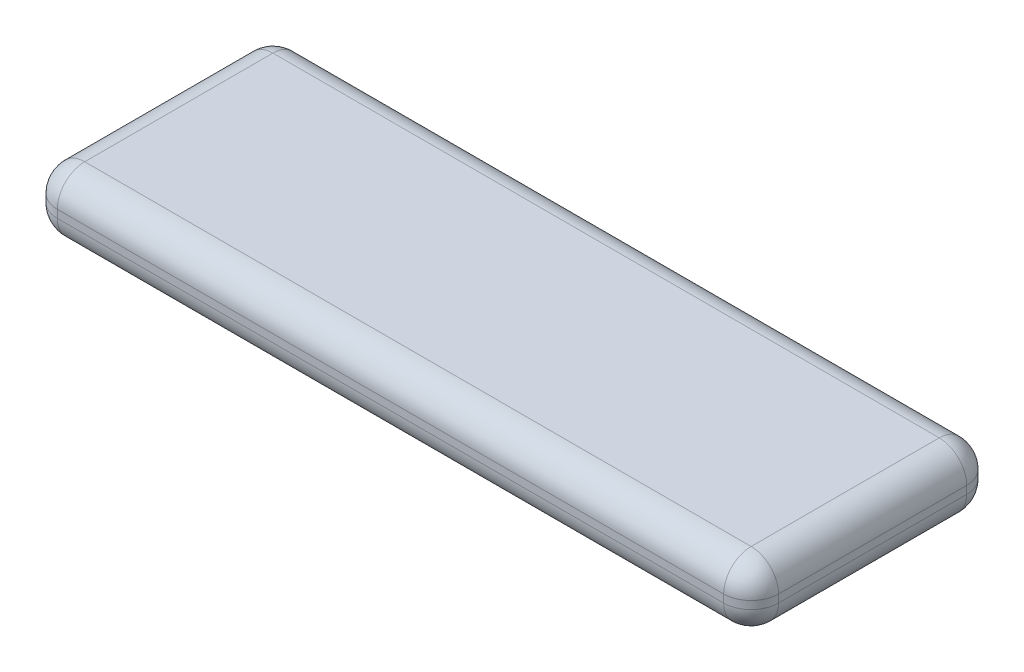
ISO-10303-21;
HEADER;
FILE_DESCRIPTION(('STEP AP214'),'2;1');
FILE_NAME('part.step','',(''),(''),'','','');
FILE_SCHEMA(('AUTOMOTIVE_DESIGN { 1 0 10303 214 1 1 1 1 }'));
ENDSEC;
DATA;
#1=APPLICATION_CONTEXT('core data for automotive mechanical design processes');
#2=APPLICATION_PROTOCOL_DEFINITION('international standard','automotive_design',2000,#1);
#3=PRODUCT_CONTEXT('',#1,'mechanical');
#4=PRODUCT('Part','Part','',(#3));
#5=PRODUCT_RELATED_PRODUCT_CATEGORY('part','',(#4));
#6=PRODUCT_DEFINITION_FORMATION('','',#4);
#7=PRODUCT_DEFINITION_CONTEXT('part definition',#1,'design');
#8=PRODUCT_DEFINITION('design','',#6,#7);
#9=PRODUCT_DEFINITION_SHAPE('','',#8);
#10=(LENGTH_UNIT() NAMED_UNIT(*) SI_UNIT(.MILLI.,.METRE.));
#11=(NAMED_UNIT(*) PLANE_ANGLE_UNIT() SI_UNIT($,.RADIAN.));
#12=(NAMED_UNIT(*) SI_UNIT($,.STERADIAN.) SOLID_ANGLE_UNIT());
#13=UNCERTAINTY_MEASURE_WITH_UNIT(LENGTH_MEASURE(1.E-05),#10,'distance_accuracy_value','');
#14=(GEOMETRIC_REPRESENTATION_CONTEXT(3) GLOBAL_UNCERTAINTY_ASSIGNED_CONTEXT((#13)) GLOBAL_UNIT_ASSIGNED_CONTEXT((#10,
#11,#12)) REPRESENTATION_CONTEXT('',''));
#15=CARTESIAN_POINT('',(0.,0.,0.));
#16=DIRECTION('',(0.,0.,1.));
#17=DIRECTION('',(1.,0.,0.));
#18=AXIS2_PLACEMENT_3D('',#15,#16,#17);
#19=CARTESIAN_POINT('',(42.5,-37.5,119.));
#20=DIRECTION('',(0.,-1.,0.));
#21=DIRECTION('',(1.,0.,0.));
#22=AXIS2_PLACEMENT_3D('',#19,#20,#21);
#23=SPHERICAL_SURFACE('',#22,3.5);
#24=CARTESIAN_POINT('',(42.5,-37.5,119.));
#25=DIRECTION('',(0.,0.,-1.));
#26=DIRECTION('',(1.,0.,0.));
#27=AXIS2_PLACEMENT_3D('',#24,#25,#26);
#28=CIRCLE('',#27,3.5);
#29=CARTESIAN_POINT('',(42.5,-34.,119.));
#30=VERTEX_POINT('',#29);
#31=CARTESIAN_POINT('',(46.,-37.5,119.));
#32=VERTEX_POINT('',#31);
#33=EDGE_CURVE('E10',#30,#32,#28,.T.);
#34=ORIENTED_EDGE('',*,*,#33,.F.);
#35=CARTESIAN_POINT('',(42.5,-37.5,119.));
#36=DIRECTION('',(1.,0.,0.));
#37=DIRECTION('',(0.,0.,1.));
#38=AXIS2_PLACEMENT_3D('',#35,#36,#37);
#39=CIRCLE('',#38,3.5);
#40=CARTESIAN_POINT('',(42.5,-37.5,122.5));
#41=VERTEX_POINT('',#40);
#42=EDGE_CURVE('E313',#30,#41,#39,.T.);
#43=ORIENTED_EDGE('',*,*,#42,.T.);
#44=CARTESIAN_POINT('',(42.5,-37.5,119.));
#45=DIRECTION('',(0.,-1.,0.));
#46=DIRECTION('',(1.,0.,0.));
#47=AXIS2_PLACEMENT_3D('',#44,#45,#46);
#48=CIRCLE('',#47,3.5);
#49=EDGE_CURVE('E205',#32,#41,#48,.T.);
#50=ORIENTED_EDGE('',*,*,#49,.F.);
#51=EDGE_LOOP('',(#34,#43,#50));
#52=FACE_BOUND('',#51,.T.);
#53=ADVANCED_FACE('F16',(#52),#23,.T.);
#54=CARTESIAN_POINT('',(42.5,-37.5,95.));
#55=DIRECTION('',(0.,0.,1.));
#56=DIRECTION('',(1.,0.,0.));
#57=AXIS2_PLACEMENT_3D('',#54,#55,#56);
#58=SPHERICAL_SURFACE('',#57,3.5);
#59=CARTESIAN_POINT('',(42.5,-37.5,95.));
#60=DIRECTION('',(0.,-1.,0.));
#61=DIRECTION('',(1.,0.,0.));
#62=AXIS2_PLACEMENT_3D('',#59,#60,#61);
#63=CIRCLE('',#62,3.5);
#64=CARTESIAN_POINT('',(42.5,-37.5,91.5));
#65=VERTEX_POINT('',#64);
#66=CARTESIAN_POINT('',(46.,-37.5,95.));
#67=VERTEX_POINT('',#66);
#68=EDGE_CURVE('E299',#65,#67,#63,.T.);
#69=ORIENTED_EDGE('',*,*,#68,.F.);
#70=CARTESIAN_POINT('',(42.5,-37.5,95.));
#71=DIRECTION('',(1.,0.,0.));
#72=DIRECTION('',(0.,1.,0.));
#73=AXIS2_PLACEMENT_3D('',#70,#71,#72);
#74=CIRCLE('',#73,3.5);
#75=CARTESIAN_POINT('',(42.5,-34.,95.));
#76=VERTEX_POINT('',#75);
#77=EDGE_CURVE('E219',#65,#76,#74,.T.);
#78=ORIENTED_EDGE('',*,*,#77,.T.);
#79=CARTESIAN_POINT('',(42.5,-37.5,95.));
#80=DIRECTION('',(0.,0.,1.));
#81=DIRECTION('',(1.,0.,0.));
#82=AXIS2_PLACEMENT_3D('',#79,#80,#81);
#83=CIRCLE('',#82,3.5);
#84=EDGE_CURVE('E19',#67,#76,#83,.T.);
#85=ORIENTED_EDGE('',*,*,#84,.F.);
#86=EDGE_LOOP('',(#69,#78,#85));
#87=FACE_BOUND('',#86,.T.);
#88=ADVANCED_FACE('F334',(#87),#58,.T.);
#89=CARTESIAN_POINT('',(46.,-42.,91.5));
#90=DIRECTION('',(1.,0.,0.));
#91=DIRECTION('',(0.,1.,0.));
#92=AXIS2_PLACEMENT_3D('',#89,#90,#91);
#93=PLANE('',#92);
#94=DIRECTION('',(0.,0.,1.));
#95=VECTOR('',#94,1.);
#96=CARTESIAN_POINT('',(46.,-38.5,91.5));
#97=LINE('',#96,#95);
#98=CARTESIAN_POINT('',(46.,-38.5,95.));
#99=VERTEX_POINT('',#98);
#100=CARTESIAN_POINT('',(46.,-38.5,119.));
#101=VERTEX_POINT('',#100);
#102=EDGE_CURVE('E223',#99,#101,#97,.T.);
#103=ORIENTED_EDGE('',*,*,#102,.F.);
#104=DIRECTION('',(0.,1.,0.));
#105=VECTOR('',#104,1.);
#106=CARTESIAN_POINT('',(46.,-42.,95.));
#107=LINE('',#106,#105);
#108=EDGE_CURVE('E303',#99,#67,#107,.T.);
#109=ORIENTED_EDGE('',*,*,#108,.T.);
#110=DIRECTION('',(0.,0.,1.));
#111=VECTOR('',#110,1.);
#112=CARTESIAN_POINT('',(46.,-37.5,91.5));
#113=LINE('',#112,#111);
#114=EDGE_CURVE('E321',#67,#32,#113,.T.);
#115=ORIENTED_EDGE('',*,*,#114,.T.);
#116=DIRECTION('',(0.,1.,0.));
#117=VECTOR('',#116,1.);
#118=CARTESIAN_POINT('',(46.,-42.,119.));
#119=LINE('',#118,#117);
#120=EDGE_CURVE('E209',#101,#32,#119,.T.);
#121=ORIENTED_EDGE('',*,*,#120,.F.);
#122=EDGE_LOOP('',(#103,#109,#115,#121));
#123=FACE_BOUND('',#122,.T.);
#124=ADVANCED_FACE('F360',(#123),#93,.T.);
#125=CARTESIAN_POINT('',(42.5,-38.5,119.));
#126=DIRECTION('',(0.,0.,-1.));
#127=DIRECTION('',(1.,0.,0.));
#128=AXIS2_PLACEMENT_3D('',#125,#126,#127);
#129=SPHERICAL_SURFACE('',#128,3.5);
#130=CARTESIAN_POINT('',(42.5,-38.5,119.));
#131=DIRECTION('',(0.,1.,0.));
#132=DIRECTION('',(1.,0.,0.));
#133=AXIS2_PLACEMENT_3D('',#130,#131,#132);
#134=CIRCLE('',#133,3.5);
#135=CARTESIAN_POINT('',(42.5,-38.5,122.5));
#136=VERTEX_POINT('',#135);
#137=EDGE_CURVE('E208',#136,#101,#134,.T.);
#138=ORIENTED_EDGE('',*,*,#137,.F.);
#139=CARTESIAN_POINT('',(42.5,-38.5,119.));
#140=DIRECTION('',(1.,0.,0.));
#141=DIRECTION('',(0.,-1.,0.));
#142=AXIS2_PLACEMENT_3D('',#139,#140,#141);
#143=CIRCLE('',#142,3.5);
#144=CARTESIAN_POINT('',(42.5,-42.,119.));
#145=VERTEX_POINT('',#144);
#146=EDGE_CURVE('E289',#136,#145,#143,.T.);
#147=ORIENTED_EDGE('',*,*,#146,.T.);
#148=CARTESIAN_POINT('',(42.5,-38.5,119.));
#149=DIRECTION('',(0.,0.,-1.));
#150=DIRECTION('',(1.,0.,0.));
#151=AXIS2_PLACEMENT_3D('',#148,#149,#150);
#152=CIRCLE('',#151,3.5);
#153=EDGE_CURVE('E293',#101,#145,#152,.T.);
#154=ORIENTED_EDGE('',*,*,#153,.F.);
#155=EDGE_LOOP('',(#138,#147,#154));
#156=FACE_BOUND('',#155,.T.);
#157=ADVANCED_FACE('F365',(#156),#129,.T.);
#158=CARTESIAN_POINT('',(42.5,-38.5,95.));
#159=DIRECTION('',(0.,0.,1.));
#160=DIRECTION('',(1.,0.,0.));
#161=AXIS2_PLACEMENT_3D('',#158,#159,#160);
#162=SPHERICAL_SURFACE('',#161,3.5);
#163=CARTESIAN_POINT('',(42.5,-38.5,95.));
#164=DIRECTION('',(0.,0.,-1.));
#165=DIRECTION('',(1.,0.,0.));
#166=AXIS2_PLACEMENT_3D('',#163,#164,#165);
#167=CIRCLE('',#166,3.5);
#168=CARTESIAN_POINT('',(42.5,-42.,95.));
#169=VERTEX_POINT('',#168);
#170=EDGE_CURVE('E296',#99,#169,#167,.T.);
#171=ORIENTED_EDGE('',*,*,#170,.T.);
#172=CARTESIAN_POINT('',(42.5,-38.5,95.));
#173=DIRECTION('',(-1.,0.,0.));
#174=DIRECTION('',(0.,-1.,0.));
#175=AXIS2_PLACEMENT_3D('',#172,#173,#174);
#176=CIRCLE('',#175,3.5);
#177=CARTESIAN_POINT('',(42.5,-38.5,91.5));
#178=VERTEX_POINT('',#177);
#179=EDGE_CURVE('E285',#178,#169,#176,.T.);
#180=ORIENTED_EDGE('',*,*,#179,.F.);
#181=CARTESIAN_POINT('',(42.5,-38.5,95.));
#182=DIRECTION('',(0.,-1.,0.));
#183=DIRECTION('',(1.,0.,0.));
#184=AXIS2_PLACEMENT_3D('',#181,#182,#183);
#185=CIRCLE('',#184,3.5);
#186=EDGE_CURVE('E222',#178,#99,#185,.T.);
#187=ORIENTED_EDGE('',*,*,#186,.T.);
#188=EDGE_LOOP('',(#171,#180,#187));
#189=FACE_BOUND('',#188,.T.);
#190=ADVANCED_FACE('F374',(#189),#162,.T.);
#191=CARTESIAN_POINT('',(42.5,-37.5,91.5));
#192=DIRECTION('',(0.,0.,1.));
#193=DIRECTION('',(1.,0.,0.));
#194=AXIS2_PLACEMENT_3D('',#191,#192,#193);
#195=CYLINDRICAL_SURFACE('',#194,3.5);
#196=ORIENTED_EDGE('',*,*,#114,.F.);
#197=ORIENTED_EDGE('',*,*,#84,.T.);
#198=DIRECTION('',(0.,0.,1.));
#199=VECTOR('',#198,1.);
#200=CARTESIAN_POINT('',(42.5,-34.,91.5));
#201=LINE('',#200,#199);
#202=EDGE_CURVE('E278',#76,#30,#201,.T.);
#203=ORIENTED_EDGE('',*,*,#202,.T.);
#204=ORIENTED_EDGE('',*,*,#33,.T.);
#205=EDGE_LOOP('',(#196,#197,#203,#204));
#206=FACE_BOUND('',#205,.T.);
#207=ADVANCED_FACE('F331',(#206),#195,.T.);
#208=CARTESIAN_POINT('',(42.5,-42.,119.));
#209=DIRECTION('',(0.,1.,0.));
#210=DIRECTION('',(1.,0.,0.));
#211=AXIS2_PLACEMENT_3D('',#208,#209,#210);
#212=CYLINDRICAL_SURFACE('',#211,3.5);
#213=ORIENTED_EDGE('',*,*,#120,.T.);
#214=ORIENTED_EDGE('',*,*,#49,.T.);
#215=DIRECTION('',(0.,1.,0.));
#216=VECTOR('',#215,1.);
#217=CARTESIAN_POINT('',(42.5,-42.,122.5));
#218=LINE('',#217,#216);
#219=EDGE_CURVE('E263',#136,#41,#218,.T.);
#220=ORIENTED_EDGE('',*,*,#219,.F.);
#221=ORIENTED_EDGE('',*,*,#137,.T.);
#222=EDGE_LOOP('',(#213,#214,#220,#221));
#223=FACE_BOUND('',#222,.T.);
#224=ADVANCED_FACE('F353',(#223),#212,.T.);
#225=CARTESIAN_POINT('',(-46.,-37.5,119.));
#226=DIRECTION('',(1.,0.,0.));
#227=DIRECTION('',(0.,1.,0.));
#228=AXIS2_PLACEMENT_3D('',#225,#226,#227);
#229=CYLINDRICAL_SURFACE('',#228,3.5);
#230=CARTESIAN_POINT('',(-42.5,-37.5,119.));
#231=DIRECTION('',(1.,0.,0.));
#232=DIRECTION('',(0.,0.,1.));
#233=AXIS2_PLACEMENT_3D('',#230,#231,#232);
#234=CIRCLE('',#233,3.5);
#235=CARTESIAN_POINT('',(-42.5,-34.,119.));
#236=VERTEX_POINT('',#235);
#237=CARTESIAN_POINT('',(-42.5,-37.5,122.5));
#238=VERTEX_POINT('',#237);
#239=EDGE_CURVE('E271',#236,#238,#234,.T.);
#240=ORIENTED_EDGE('',*,*,#239,.T.);
#241=DIRECTION('',(1.,0.,0.));
#242=VECTOR('',#241,1.);
#243=CARTESIAN_POINT('',(-46.,-37.5,122.5));
#244=LINE('',#243,#242);
#245=EDGE_CURVE('E267',#238,#41,#244,.T.);
#246=ORIENTED_EDGE('',*,*,#245,.T.);
#247=ORIENTED_EDGE('',*,*,#42,.F.);
#248=DIRECTION('',(1.,0.,0.));
#249=VECTOR('',#248,1.);
#250=CARTESIAN_POINT('',(-46.,-34.,119.));
#251=LINE('',#250,#249);
#252=EDGE_CURVE('E274',#236,#30,#251,.T.);
#253=ORIENTED_EDGE('',*,*,#252,.F.);
#254=EDGE_LOOP('',(#240,#246,#247,#253));
#255=FACE_BOUND('',#254,.T.);
#256=ADVANCED_FACE('F345',(#255),#229,.T.);
#257=CARTESIAN_POINT('',(42.5,-42.,95.));
#258=DIRECTION('',(0.,1.,0.));
#259=DIRECTION('',(1.,0.,0.));
#260=AXIS2_PLACEMENT_3D('',#257,#258,#259);
#261=CYLINDRICAL_SURFACE('',#260,3.5);
#262=ORIENTED_EDGE('',*,*,#186,.F.);
#263=DIRECTION('',(0.,1.,0.));
#264=VECTOR('',#263,1.);
#265=CARTESIAN_POINT('',(42.5,-42.,91.5));
#266=LINE('',#265,#264);
#267=EDGE_CURVE('E247',#178,#65,#266,.T.);
#268=ORIENTED_EDGE('',*,*,#267,.T.);
#269=ORIENTED_EDGE('',*,*,#68,.T.);
#270=ORIENTED_EDGE('',*,*,#108,.F.);
#271=EDGE_LOOP('',(#262,#268,#269,#270));
#272=FACE_BOUND('',#271,.T.);
#273=ADVANCED_FACE('F393',(#272),#261,.T.);
#274=CARTESIAN_POINT('',(-46.,-37.5,95.));
#275=DIRECTION('',(1.,0.,0.));
#276=DIRECTION('',(0.,1.,0.));
#277=AXIS2_PLACEMENT_3D('',#274,#275,#276);
#278=CYLINDRICAL_SURFACE('',#277,3.5);
#279=DIRECTION('',(1.,0.,0.));
#280=VECTOR('',#279,1.);
#281=CARTESIAN_POINT('',(-46.,-34.,95.));
#282=LINE('',#281,#280);
#283=CARTESIAN_POINT('',(-42.5,-34.,95.));
#284=VERTEX_POINT('',#283);
#285=EDGE_CURVE('E281',#284,#76,#282,.T.);
#286=ORIENTED_EDGE('',*,*,#285,.T.);
#287=ORIENTED_EDGE('',*,*,#77,.F.);
#288=DIRECTION('',(1.,0.,0.));
#289=VECTOR('',#288,1.);
#290=CARTESIAN_POINT('',(-46.,-37.5,91.5));
#291=LINE('',#290,#289);
#292=CARTESIAN_POINT('',(-42.5,-37.5,91.5));
#293=VERTEX_POINT('',#292);
#294=EDGE_CURVE('E240',#293,#65,#291,.T.);
#295=ORIENTED_EDGE('',*,*,#294,.F.);
#296=CARTESIAN_POINT('',(-42.5,-37.5,95.));
#297=DIRECTION('',(1.,0.,0.));
#298=DIRECTION('',(0.,1.,0.));
#299=AXIS2_PLACEMENT_3D('',#296,#297,#298);
#300=CIRCLE('',#299,3.5);
#301=EDGE_CURVE('E255',#293,#284,#300,.T.);
#302=ORIENTED_EDGE('',*,*,#301,.T.);
#303=EDGE_LOOP('',(#286,#287,#295,#302));
#304=FACE_BOUND('',#303,.T.);
#305=ADVANCED_FACE('F337',(#304),#278,.T.);
#306=CARTESIAN_POINT('',(42.5,-38.5,91.5));
#307=DIRECTION('',(0.,0.,1.));
#308=DIRECTION('',(1.,0.,0.));
#309=AXIS2_PLACEMENT_3D('',#306,#307,#308);
#310=CYLINDRICAL_SURFACE('',#309,3.5);
#311=ORIENTED_EDGE('',*,*,#153,.T.);
#312=DIRECTION('',(0.,0.,1.));
#313=VECTOR('',#312,1.);
#314=CARTESIAN_POINT('',(42.5,-42.,91.5));
#315=LINE('',#314,#313);
#316=EDGE_CURVE('E197',#169,#145,#315,.T.);
#317=ORIENTED_EDGE('',*,*,#316,.F.);
#318=ORIENTED_EDGE('',*,*,#170,.F.);
#319=ORIENTED_EDGE('',*,*,#102,.T.);
#320=EDGE_LOOP('',(#311,#317,#318,#319));
#321=FACE_BOUND('',#320,.T.);
#322=ADVANCED_FACE('F390',(#321),#310,.T.);
#323=CARTESIAN_POINT('',(-46.,-38.5,119.));
#324=DIRECTION('',(1.,0.,0.));
#325=DIRECTION('',(0.,-1.,0.));
#326=AXIS2_PLACEMENT_3D('',#323,#324,#325);
#327=CYLINDRICAL_SURFACE('',#326,3.5);
#328=DIRECTION('',(1.,0.,0.));
#329=VECTOR('',#328,1.);
#330=CARTESIAN_POINT('',(-46.,-42.,119.));
#331=LINE('',#330,#329);
#332=CARTESIAN_POINT('',(-42.5,-42.,119.));
#333=VERTEX_POINT('',#332);
#334=EDGE_CURVE('E201',#333,#145,#331,.T.);
#335=ORIENTED_EDGE('',*,*,#334,.T.);
#336=ORIENTED_EDGE('',*,*,#146,.F.);
#337=DIRECTION('',(1.,0.,0.));
#338=VECTOR('',#337,1.);
#339=CARTESIAN_POINT('',(-46.,-38.5,122.5));
#340=LINE('',#339,#338);
#341=CARTESIAN_POINT('',(-42.5,-38.5,122.5));
#342=VERTEX_POINT('',#341);
#343=EDGE_CURVE('E259',#342,#136,#340,.T.);
#344=ORIENTED_EDGE('',*,*,#343,.F.);
#345=CARTESIAN_POINT('',(-42.5,-38.5,119.));
#346=DIRECTION('',(1.,0.,0.));
#347=DIRECTION('',(0.,-1.,0.));
#348=AXIS2_PLACEMENT_3D('',#345,#346,#347);
#349=CIRCLE('',#348,3.5);
#350=EDGE_CURVE('E140',#342,#333,#349,.T.);
#351=ORIENTED_EDGE('',*,*,#350,.T.);
#352=EDGE_LOOP('',(#335,#336,#344,#351));
#353=FACE_BOUND('',#352,.T.);
#354=ADVANCED_FACE('F384',(#353),#327,.T.);
#355=CARTESIAN_POINT('',(-46.,-38.5,95.));
#356=DIRECTION('',(1.,0.,0.));
#357=DIRECTION('',(0.,-1.,0.));
#358=AXIS2_PLACEMENT_3D('',#355,#356,#357);
#359=CYLINDRICAL_SURFACE('',#358,3.5);
#360=CARTESIAN_POINT('',(-42.5,-38.5,95.));
#361=DIRECTION('',(-1.,0.,0.));
#362=DIRECTION('',(0.,-1.,0.));
#363=AXIS2_PLACEMENT_3D('',#360,#361,#362);
#364=CIRCLE('',#363,3.5);
#365=CARTESIAN_POINT('',(-42.5,-38.5,91.5));
#366=VERTEX_POINT('',#365);
#367=CARTESIAN_POINT('',(-42.5,-42.,95.));
#368=VERTEX_POINT('',#367);
#369=EDGE_CURVE('E185',#366,#368,#364,.T.);
#370=ORIENTED_EDGE('',*,*,#369,.F.);
#371=DIRECTION('',(1.,0.,0.));
#372=VECTOR('',#371,1.);
#373=CARTESIAN_POINT('',(-46.,-38.5,91.5));
#374=LINE('',#373,#372);
#375=EDGE_CURVE('E251',#366,#178,#374,.T.);
#376=ORIENTED_EDGE('',*,*,#375,.T.);
#377=ORIENTED_EDGE('',*,*,#179,.T.);
#378=DIRECTION('',(1.,0.,0.));
#379=VECTOR('',#378,1.);
#380=CARTESIAN_POINT('',(-46.,-42.,95.));
#381=LINE('',#380,#379);
#382=EDGE_CURVE('E202',#368,#169,#381,.T.);
#383=ORIENTED_EDGE('',*,*,#382,.F.);
#384=EDGE_LOOP('',(#370,#376,#377,#383));
#385=FACE_BOUND('',#384,.T.);
#386=ADVANCED_FACE('F425',(#385),#359,.T.);
#387=CARTESIAN_POINT('',(-46.,-34.,91.5));
#388=DIRECTION('',(0.,1.,0.));
#389=DIRECTION('',(1.,0.,0.));
#390=AXIS2_PLACEMENT_3D('',#387,#388,#389);
#391=PLANE('',#390);
#392=DIRECTION('',(0.,0.,1.));
#393=VECTOR('',#392,1.);
#394=CARTESIAN_POINT('',(-42.5,-34.,91.5));
#395=LINE('',#394,#393);
#396=EDGE_CURVE('E228',#284,#236,#395,.T.);
#397=ORIENTED_EDGE('',*,*,#396,.T.);
#398=ORIENTED_EDGE('',*,*,#252,.T.);
#399=ORIENTED_EDGE('',*,*,#202,.F.);
#400=ORIENTED_EDGE('',*,*,#285,.F.);
#401=EDGE_LOOP('',(#397,#398,#399,#400));
#402=FACE_BOUND('',#401,.T.);
#403=ADVANCED_FACE('F339',(#402),#391,.T.);
#404=CARTESIAN_POINT('',(-42.5,-37.5,119.));
#405=DIRECTION('',(0.,-1.,0.));
#406=DIRECTION('',(-1.,0.,0.));
#407=AXIS2_PLACEMENT_3D('',#404,#405,#406);
#408=SPHERICAL_SURFACE('',#407,3.5);
#409=CARTESIAN_POINT('',(-42.5,-37.5,119.));
#410=DIRECTION('',(0.,1.,0.));
#411=DIRECTION('',(-1.,0.,0.));
#412=AXIS2_PLACEMENT_3D('',#409,#410,#411);
#413=CIRCLE('',#412,3.5);
#414=CARTESIAN_POINT('',(-46.,-37.5,119.));
#415=VERTEX_POINT('',#414);
#416=EDGE_CURVE('E174',#415,#238,#413,.T.);
#417=ORIENTED_EDGE('',*,*,#416,.T.);
#418=ORIENTED_EDGE('',*,*,#239,.F.);
#419=CARTESIAN_POINT('',(-42.5,-37.5,119.));
#420=DIRECTION('',(0.,0.,1.));
#421=DIRECTION('',(-1.,0.,0.));
#422=AXIS2_PLACEMENT_3D('',#419,#420,#421);
#423=CIRCLE('',#422,3.5);
#424=EDGE_CURVE('E214',#236,#415,#423,.T.);
#425=ORIENTED_EDGE('',*,*,#424,.T.);
#426=EDGE_LOOP('',(#417,#418,#425));
#427=FACE_BOUND('',#426,.T.);
#428=ADVANCED_FACE('F348',(#427),#408,.T.);
#429=CARTESIAN_POINT('',(-46.,-42.,122.5));
#430=DIRECTION('',(0.,0.,1.));
#431=DIRECTION('',(1.,0.,0.));
#432=AXIS2_PLACEMENT_3D('',#429,#430,#431);
#433=PLANE('',#432);
#434=DIRECTION('',(0.,1.,0.));
#435=VECTOR('',#434,1.);
#436=CARTESIAN_POINT('',(-42.5,-42.,122.5));
#437=LINE('',#436,#435);
#438=EDGE_CURVE('E146',#342,#238,#437,.T.);
#439=ORIENTED_EDGE('',*,*,#438,.F.);
#440=ORIENTED_EDGE('',*,*,#343,.T.);
#441=ORIENTED_EDGE('',*,*,#219,.T.);
#442=ORIENTED_EDGE('',*,*,#245,.F.);
#443=EDGE_LOOP('',(#439,#440,#441,#442));
#444=FACE_BOUND('',#443,.T.);
#445=ADVANCED_FACE('F350',(#444),#433,.T.);
#446=CARTESIAN_POINT('',(-42.5,-37.5,95.));
#447=DIRECTION('',(0.,0.,1.));
#448=DIRECTION('',(-1.,0.,0.));
#449=AXIS2_PLACEMENT_3D('',#446,#447,#448);
#450=SPHERICAL_SURFACE('',#449,3.5);
#451=CARTESIAN_POINT('',(-42.5,-37.5,95.));
#452=DIRECTION('',(0.,0.,-1.));
#453=DIRECTION('',(-1.,0.,0.));
#454=AXIS2_PLACEMENT_3D('',#451,#452,#453);
#455=CIRCLE('',#454,3.5);
#456=CARTESIAN_POINT('',(-46.,-37.5,95.));
#457=VERTEX_POINT('',#456);
#458=EDGE_CURVE('E188',#457,#284,#455,.T.);
#459=ORIENTED_EDGE('',*,*,#458,.T.);
#460=ORIENTED_EDGE('',*,*,#301,.F.);
#461=CARTESIAN_POINT('',(-42.5,-37.5,95.));
#462=DIRECTION('',(0.,1.,0.));
#463=DIRECTION('',(-1.,0.,0.));
#464=AXIS2_PLACEMENT_3D('',#461,#462,#463);
#465=CIRCLE('',#464,3.5);
#466=EDGE_CURVE('E159',#293,#457,#465,.T.);
#467=ORIENTED_EDGE('',*,*,#466,.T.);
#468=EDGE_LOOP('',(#459,#460,#467));
#469=FACE_BOUND('',#468,.T.);
#470=ADVANCED_FACE('F404',(#469),#450,.T.);
#471=CARTESIAN_POINT('',(-46.,-42.,91.5));
#472=DIRECTION('',(0.,0.,1.));
#473=DIRECTION('',(1.,0.,0.));
#474=AXIS2_PLACEMENT_3D('',#471,#472,#473);
#475=PLANE('',#474);
#476=ORIENTED_EDGE('',*,*,#294,.T.);
#477=ORIENTED_EDGE('',*,*,#267,.F.);
#478=ORIENTED_EDGE('',*,*,#375,.F.);
#479=DIRECTION('',(0.,1.,0.));
#480=VECTOR('',#479,1.);
#481=CARTESIAN_POINT('',(-42.5,-42.,91.5));
#482=LINE('',#481,#480);
#483=EDGE_CURVE('E192',#366,#293,#482,.T.);
#484=ORIENTED_EDGE('',*,*,#483,.T.);
#485=EDGE_LOOP('',(#476,#477,#478,#484));
#486=FACE_BOUND('',#485,.T.);
#487=ADVANCED_FACE('F397',(#486),#475,.F.);
#488=CARTESIAN_POINT('',(-46.,-42.,91.5));
#489=DIRECTION('',(0.,1.,0.));
#490=DIRECTION('',(1.,0.,0.));
#491=AXIS2_PLACEMENT_3D('',#488,#489,#490);
#492=PLANE('',#491);
#493=ORIENTED_EDGE('',*,*,#382,.T.);
#494=ORIENTED_EDGE('',*,*,#316,.T.);
#495=ORIENTED_EDGE('',*,*,#334,.F.);
#496=DIRECTION('',(0.,0.,1.));
#497=VECTOR('',#496,1.);
#498=CARTESIAN_POINT('',(-42.5,-42.,91.5));
#499=LINE('',#498,#497);
#500=EDGE_CURVE('E157',#368,#333,#499,.T.);
#501=ORIENTED_EDGE('',*,*,#500,.F.);
#502=EDGE_LOOP('',(#493,#494,#495,#501));
#503=FACE_BOUND('',#502,.T.);
#504=ADVANCED_FACE('F387',(#503),#492,.F.);
#505=CARTESIAN_POINT('',(-42.5,-38.5,119.));
#506=DIRECTION('',(0.,0.,-1.));
#507=DIRECTION('',(-1.,0.,0.));
#508=AXIS2_PLACEMENT_3D('',#505,#506,#507);
#509=SPHERICAL_SURFACE('',#508,3.5);
#510=CARTESIAN_POINT('',(-42.5,-38.5,119.));
#511=DIRECTION('',(0.,0.,1.));
#512=DIRECTION('',(-1.,0.,0.));
#513=AXIS2_PLACEMENT_3D('',#510,#511,#512);
#514=CIRCLE('',#513,3.5);
#515=CARTESIAN_POINT('',(-46.,-38.5,119.));
#516=VERTEX_POINT('',#515);
#517=EDGE_CURVE('E137',#516,#333,#514,.T.);
#518=ORIENTED_EDGE('',*,*,#517,.T.);
#519=ORIENTED_EDGE('',*,*,#350,.F.);
#520=CARTESIAN_POINT('',(-42.5,-38.5,119.));
#521=DIRECTION('',(0.,-1.,0.));
#522=DIRECTION('',(-1.,0.,0.));
#523=AXIS2_PLACEMENT_3D('',#520,#521,#522);
#524=CIRCLE('',#523,3.5);
#525=EDGE_CURVE('E134',#342,#516,#524,.T.);
#526=ORIENTED_EDGE('',*,*,#525,.T.);
#527=EDGE_LOOP('',(#518,#519,#526));
#528=FACE_BOUND('',#527,.T.);
#529=ADVANCED_FACE('F136',(#528),#509,.T.);
#530=CARTESIAN_POINT('',(-42.5,-38.5,95.));
#531=DIRECTION('',(0.,0.,1.));
#532=DIRECTION('',(-1.,0.,0.));
#533=AXIS2_PLACEMENT_3D('',#530,#531,#532);
#534=SPHERICAL_SURFACE('',#533,3.5);
#535=CARTESIAN_POINT('',(-42.5,-38.5,95.));
#536=DIRECTION('',(0.,1.,0.));
#537=DIRECTION('',(-1.,0.,0.));
#538=AXIS2_PLACEMENT_3D('',#535,#536,#537);
#539=CIRCLE('',#538,3.5);
#540=CARTESIAN_POINT('',(-46.,-38.5,95.));
#541=VERTEX_POINT('',#540);
#542=EDGE_CURVE('E147',#366,#541,#539,.T.);
#543=ORIENTED_EDGE('',*,*,#542,.F.);
#544=ORIENTED_EDGE('',*,*,#369,.T.);
#545=CARTESIAN_POINT('',(-42.5,-38.5,95.));
#546=DIRECTION('',(0.,0.,1.));
#547=DIRECTION('',(-1.,0.,0.));
#548=AXIS2_PLACEMENT_3D('',#545,#546,#547);
#549=CIRCLE('',#548,3.5);
#550=EDGE_CURVE('E169',#541,#368,#549,.T.);
#551=ORIENTED_EDGE('',*,*,#550,.F.);
#552=EDGE_LOOP('',(#543,#544,#551));
#553=FACE_BOUND('',#552,.T.);
#554=ADVANCED_FACE('F408',(#553),#534,.T.);
#555=CARTESIAN_POINT('',(-42.5,-37.5,91.5));
#556=DIRECTION('',(0.,0.,1.));
#557=DIRECTION('',(-1.,0.,0.));
#558=AXIS2_PLACEMENT_3D('',#555,#556,#557);
#559=CYLINDRICAL_SURFACE('',#558,3.5);
#560=ORIENTED_EDGE('',*,*,#424,.F.);
#561=ORIENTED_EDGE('',*,*,#396,.F.);
#562=ORIENTED_EDGE('',*,*,#458,.F.);
#563=DIRECTION('',(0.,0.,1.));
#564=VECTOR('',#563,1.);
#565=CARTESIAN_POINT('',(-46.,-37.5,91.5));
#566=LINE('',#565,#564);
#567=EDGE_CURVE('E177',#457,#415,#566,.T.);
#568=ORIENTED_EDGE('',*,*,#567,.T.);
#569=EDGE_LOOP('',(#560,#561,#562,#568));
#570=FACE_BOUND('',#569,.T.);
#571=ADVANCED_FACE('F406',(#570),#559,.T.);
#572=CARTESIAN_POINT('',(-42.5,-42.,119.));
#573=DIRECTION('',(0.,1.,0.));
#574=DIRECTION('',(-1.,0.,0.));
#575=AXIS2_PLACEMENT_3D('',#572,#573,#574);
#576=CYLINDRICAL_SURFACE('',#575,3.5);
#577=ORIENTED_EDGE('',*,*,#525,.F.);
#578=ORIENTED_EDGE('',*,*,#438,.T.);
#579=ORIENTED_EDGE('',*,*,#416,.F.);
#580=DIRECTION('',(0.,1.,0.));
#581=VECTOR('',#580,1.);
#582=CARTESIAN_POINT('',(-46.,-42.,119.));
#583=LINE('',#582,#581);
#584=EDGE_CURVE('E165',#516,#415,#583,.T.);
#585=ORIENTED_EDGE('',*,*,#584,.F.);
#586=EDGE_LOOP('',(#577,#578,#579,#585));
#587=FACE_BOUND('',#586,.T.);
#588=ADVANCED_FACE('F172',(#587),#576,.T.);
#589=CARTESIAN_POINT('',(-42.5,-42.,95.));
#590=DIRECTION('',(0.,1.,0.));
#591=DIRECTION('',(-1.,0.,0.));
#592=AXIS2_PLACEMENT_3D('',#589,#590,#591);
#593=CYLINDRICAL_SURFACE('',#592,3.5);
#594=DIRECTION('',(0.,1.,0.));
#595=VECTOR('',#594,1.);
#596=CARTESIAN_POINT('',(-46.,-42.,95.));
#597=LINE('',#596,#595);
#598=EDGE_CURVE('E167',#541,#457,#597,.T.);
#599=ORIENTED_EDGE('',*,*,#598,.T.);
#600=ORIENTED_EDGE('',*,*,#466,.F.);
#601=ORIENTED_EDGE('',*,*,#483,.F.);
#602=ORIENTED_EDGE('',*,*,#542,.T.);
#603=EDGE_LOOP('',(#599,#600,#601,#602));
#604=FACE_BOUND('',#603,.T.);
#605=ADVANCED_FACE('F402',(#604),#593,.T.);
#606=CARTESIAN_POINT('',(-42.5,-38.5,91.5));
#607=DIRECTION('',(0.,0.,1.));
#608=DIRECTION('',(-1.,0.,0.));
#609=AXIS2_PLACEMENT_3D('',#606,#607,#608);
#610=CYLINDRICAL_SURFACE('',#609,3.5);
#611=DIRECTION('',(0.,0.,1.));
#612=VECTOR('',#611,1.);
#613=CARTESIAN_POINT('',(-46.,-38.5,91.5));
#614=LINE('',#613,#612);
#615=EDGE_CURVE('E154',#541,#516,#614,.T.);
#616=ORIENTED_EDGE('',*,*,#615,.F.);
#617=ORIENTED_EDGE('',*,*,#550,.T.);
#618=ORIENTED_EDGE('',*,*,#500,.T.);
#619=ORIENTED_EDGE('',*,*,#517,.F.);
#620=EDGE_LOOP('',(#616,#617,#618,#619));
#621=FACE_BOUND('',#620,.T.);
#622=ADVANCED_FACE('F152',(#621),#610,.T.);
#623=CARTESIAN_POINT('',(-46.,-42.,91.5));
#624=DIRECTION('',(1.,0.,0.));
#625=DIRECTION('',(0.,1.,0.));
#626=AXIS2_PLACEMENT_3D('',#623,#624,#625);
#627=PLANE('',#626);
#628=ORIENTED_EDGE('',*,*,#584,.T.);
#629=ORIENTED_EDGE('',*,*,#567,.F.);
#630=ORIENTED_EDGE('',*,*,#598,.F.);
#631=ORIENTED_EDGE('',*,*,#615,.T.);
#632=EDGE_LOOP('',(#628,#629,#630,#631));
#633=FACE_BOUND('',#632,.T.);
#634=ADVANCED_FACE('F163',(#633),#627,.F.);
#635=CLOSED_SHELL('',(#53,#88,#124,#157,#190,#207,#224,#256,#273,#305,#322,#354,#386,#403,#428,
#445,#470,#487,#504,#529,#554,#571,#588,#605,#622,#634));
#636=MANIFOLD_SOLID_BREP('B1',#635);
#637=ADVANCED_BREP_SHAPE_REPRESENTATION('',(#18,#636),#14);
#638=SHAPE_DEFINITION_REPRESENTATION(#9,#637);
ENDSEC;
END-ISO-10303-21;
